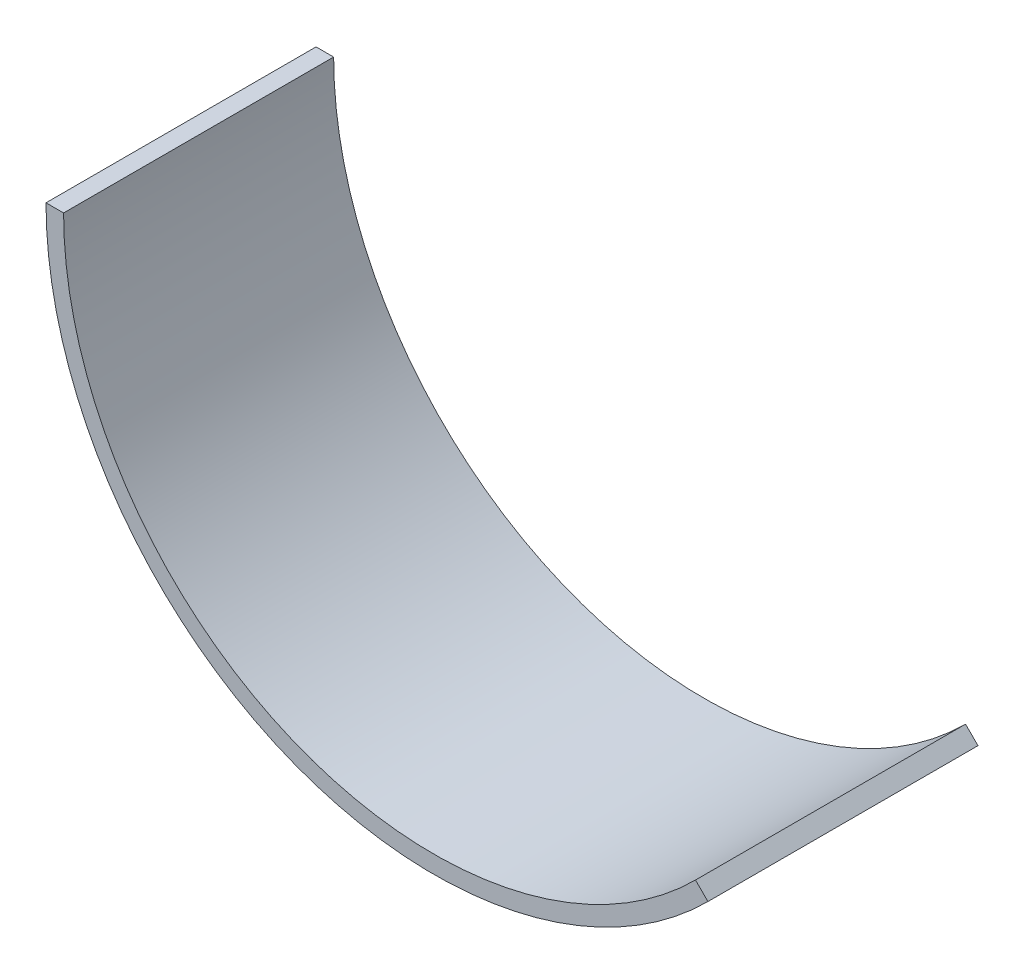
ISO-10303-21;
HEADER;
FILE_DESCRIPTION(('STEP AP214'),'2;1');
FILE_NAME('part.step','',(''),(''),'','','');
FILE_SCHEMA(('AUTOMOTIVE_DESIGN { 1 0 10303 214 1 1 1 1 }'));
ENDSEC;
DATA;
#1=APPLICATION_CONTEXT('core data for automotive mechanical design processes');
#2=APPLICATION_PROTOCOL_DEFINITION('international standard','automotive_design',2000,#1);
#3=PRODUCT_CONTEXT('',#1,'mechanical');
#4=PRODUCT('Part','Part','',(#3));
#5=PRODUCT_RELATED_PRODUCT_CATEGORY('part','',(#4));
#6=PRODUCT_DEFINITION_FORMATION('','',#4);
#7=PRODUCT_DEFINITION_CONTEXT('part definition',#1,'design');
#8=PRODUCT_DEFINITION('design','',#6,#7);
#9=PRODUCT_DEFINITION_SHAPE('','',#8);
#10=(LENGTH_UNIT() NAMED_UNIT(*) SI_UNIT(.MILLI.,.METRE.));
#11=(NAMED_UNIT(*) PLANE_ANGLE_UNIT() SI_UNIT($,.RADIAN.));
#12=(NAMED_UNIT(*) SI_UNIT($,.STERADIAN.) SOLID_ANGLE_UNIT());
#13=UNCERTAINTY_MEASURE_WITH_UNIT(LENGTH_MEASURE(1.E-05),#10,'distance_accuracy_value','');
#14=(GEOMETRIC_REPRESENTATION_CONTEXT(3) GLOBAL_UNCERTAINTY_ASSIGNED_CONTEXT((#13)) GLOBAL_UNIT_ASSIGNED_CONTEXT((#10,
#11,#12)) REPRESENTATION_CONTEXT('',''));
#15=CARTESIAN_POINT('',(0.,0.,0.));
#16=DIRECTION('',(0.,0.,1.));
#17=DIRECTION('',(1.,0.,0.));
#18=AXIS2_PLACEMENT_3D('',#15,#16,#17);
#19=CARTESIAN_POINT('',(0.,0.,50.699999946));
#20=DIRECTION('',(0.,0.,-1.));
#21=DIRECTION('',(-1.,0.,0.));
#22=AXIS2_PLACEMENT_3D('',#19,#20,#21);
#23=CYLINDRICAL_SURFACE('',#22,69.495999946);
#24=CARTESIAN_POINT('',(0.,0.,0.));
#25=DIRECTION('',(0.,0.,-1.));
#26=DIRECTION('',(1.,0.,0.));
#27=AXIS2_PLACEMENT_3D('',#24,#25,#26);
#28=CIRCLE('',#27,69.495999946);
#29=CARTESIAN_POINT('',(49.1410928271565,-49.1410928271565,0.));
#30=VERTEX_POINT('',#29);
#31=CARTESIAN_POINT('',(-69.495999946,0.,0.));
#32=VERTEX_POINT('',#31);
#33=EDGE_CURVE('E96',#30,#32,#28,.T.);
#34=ORIENTED_EDGE('',*,*,#33,.T.);
#35=DIRECTION('',(0.,0.,-1.));
#36=VECTOR('',#35,1.);
#37=CARTESIAN_POINT('',(-69.495999946,0.,50.699999946));
#38=LINE('',#37,#36);
#39=CARTESIAN_POINT('',(-69.495999946,0.,50.699999946));
#40=VERTEX_POINT('',#39);
#41=EDGE_CURVE('E11',#40,#32,#38,.T.);
#42=ORIENTED_EDGE('',*,*,#41,.F.);
#43=CARTESIAN_POINT('',(0.,0.,50.699999946));
#44=DIRECTION('',(0.,0.,-1.));
#45=DIRECTION('',(1.,0.,0.));
#46=AXIS2_PLACEMENT_3D('',#43,#44,#45);
#47=CIRCLE('',#46,69.495999946);
#48=CARTESIAN_POINT('',(49.1410928271565,-49.1410928271565,50.699999946));
#49=VERTEX_POINT('',#48);
#50=EDGE_CURVE('E84',#49,#40,#47,.T.);
#51=ORIENTED_EDGE('',*,*,#50,.F.);
#52=DIRECTION('',(0.,0.,-1.));
#53=VECTOR('',#52,1.);
#54=CARTESIAN_POINT('',(49.1410928271565,-49.1410928271565,50.699999946));
#55=LINE('',#54,#53);
#56=EDGE_CURVE('E92',#49,#30,#55,.T.);
#57=ORIENTED_EDGE('',*,*,#56,.T.);
#58=EDGE_LOOP('',(#34,#42,#51,#57));
#59=FACE_BOUND('',#58,.T.);
#60=ADVANCED_FACE('F33',(#59),#23,.F.);
#61=CARTESIAN_POINT('',(-72.797999946,0.,50.699999946));
#62=DIRECTION('',(0.,-1.,0.));
#63=DIRECTION('',(0.,0.,-1.));
#64=AXIS2_PLACEMENT_3D('',#61,#62,#63);
#65=PLANE('',#64);
#66=DIRECTION('',(-1.,0.,0.));
#67=VECTOR('',#66,1.);
#68=CARTESIAN_POINT('',(-72.797999946,0.,0.));
#69=LINE('',#68,#67);
#70=CARTESIAN_POINT('',(-72.797999946,0.,0.));
#71=VERTEX_POINT('',#70);
#72=EDGE_CURVE('E88',#32,#71,#69,.T.);
#73=ORIENTED_EDGE('',*,*,#72,.T.);
#74=DIRECTION('',(0.,0.,-1.));
#75=VECTOR('',#74,1.);
#76=CARTESIAN_POINT('',(-72.797999946,0.,50.699999946));
#77=LINE('',#76,#75);
#78=CARTESIAN_POINT('',(-72.797999946,0.,50.699999946));
#79=VERTEX_POINT('',#78);
#80=EDGE_CURVE('E41',#79,#71,#77,.T.);
#81=ORIENTED_EDGE('',*,*,#80,.F.);
#82=DIRECTION('',(-1.,0.,0.));
#83=VECTOR('',#82,1.);
#84=CARTESIAN_POINT('',(-72.797999946,0.,50.699999946));
#85=LINE('',#84,#83);
#86=EDGE_CURVE('E79',#40,#79,#85,.T.);
#87=ORIENTED_EDGE('',*,*,#86,.F.);
#88=ORIENTED_EDGE('',*,*,#41,.T.);
#89=EDGE_LOOP('',(#73,#81,#87,#88));
#90=FACE_BOUND('',#89,.T.);
#91=ADVANCED_FACE('F87',(#90),#65,.F.);
#92=CARTESIAN_POINT('',(0.,0.,50.699999946));
#93=DIRECTION('',(0.,0.,-1.));
#94=DIRECTION('',(-1.,0.,0.));
#95=AXIS2_PLACEMENT_3D('',#92,#93,#94);
#96=CYLINDRICAL_SURFACE('',#95,72.797999946);
#97=CARTESIAN_POINT('',(0.,0.,0.));
#98=DIRECTION('',(0.,0.,1.));
#99=DIRECTION('',(1.,0.,0.));
#100=AXIS2_PLACEMENT_3D('',#97,#98,#99);
#101=CIRCLE('',#100,72.797999946);
#102=CARTESIAN_POINT('',(51.4759594186345,-51.4759594186345,0.));
#103=VERTEX_POINT('',#102);
#104=EDGE_CURVE('E66',#71,#103,#101,.T.);
#105=ORIENTED_EDGE('',*,*,#104,.T.);
#106=DIRECTION('',(0.,0.,-1.));
#107=VECTOR('',#106,1.);
#108=CARTESIAN_POINT('',(51.4759594186345,-51.4759594186345,50.699999946));
#109=LINE('',#108,#107);
#110=CARTESIAN_POINT('',(51.4759594186345,-51.4759594186345,50.699999946));
#111=VERTEX_POINT('',#110);
#112=EDGE_CURVE('E89',#111,#103,#109,.T.);
#113=ORIENTED_EDGE('',*,*,#112,.F.);
#114=CARTESIAN_POINT('',(0.,0.,50.699999946));
#115=DIRECTION('',(0.,0.,1.));
#116=DIRECTION('',(1.,0.,0.));
#117=AXIS2_PLACEMENT_3D('',#114,#115,#116);
#118=CIRCLE('',#117,72.797999946);
#119=EDGE_CURVE('E82',#79,#111,#118,.T.);
#120=ORIENTED_EDGE('',*,*,#119,.F.);
#121=ORIENTED_EDGE('',*,*,#80,.T.);
#122=EDGE_LOOP('',(#105,#113,#120,#121));
#123=FACE_BOUND('',#122,.T.);
#124=ADVANCED_FACE('F90',(#123),#96,.T.);
#125=CARTESIAN_POINT('',(49.1410928271565,-49.1410928271565,50.699999946));
#126=DIRECTION('',(-0.707106781186548,-0.707106781186548,0.));
#127=DIRECTION('',(0.707106781186548,-0.707106781186548,0.));
#128=AXIS2_PLACEMENT_3D('',#125,#126,#127);
#129=PLANE('',#128);
#130=DIRECTION('',(-0.707106781186547,0.707106781186547,0.));
#131=VECTOR('',#130,1.);
#132=CARTESIAN_POINT('',(49.1410928271565,-49.1410928271565,0.));
#133=LINE('',#132,#131);
#134=EDGE_CURVE('E72',#103,#30,#133,.T.);
#135=ORIENTED_EDGE('',*,*,#134,.T.);
#136=ORIENTED_EDGE('',*,*,#56,.F.);
#137=DIRECTION('',(-0.707106781186547,0.707106781186547,0.));
#138=VECTOR('',#137,1.);
#139=CARTESIAN_POINT('',(49.1410928271565,-49.1410928271565,50.699999946));
#140=LINE('',#139,#138);
#141=EDGE_CURVE('E49',#111,#49,#140,.T.);
#142=ORIENTED_EDGE('',*,*,#141,.F.);
#143=ORIENTED_EDGE('',*,*,#112,.T.);
#144=EDGE_LOOP('',(#135,#136,#142,#143));
#145=FACE_BOUND('',#144,.T.);
#146=ADVANCED_FACE('F103',(#145),#129,.F.);
#147=CARTESIAN_POINT('',(0.,0.,50.699999946));
#148=DIRECTION('',(0.,0.,1.));
#149=DIRECTION('',(1.,0.,0.));
#150=AXIS2_PLACEMENT_3D('',#147,#148,#149);
#151=PLANE('',#150);
#152=ORIENTED_EDGE('',*,*,#50,.T.);
#153=ORIENTED_EDGE('',*,*,#86,.T.);
#154=ORIENTED_EDGE('',*,*,#119,.T.);
#155=ORIENTED_EDGE('',*,*,#141,.T.);
#156=EDGE_LOOP('',(#152,#153,#154,#155));
#157=FACE_BOUND('',#156,.T.);
#158=ADVANCED_FACE('F80',(#157),#151,.T.);
#159=CARTESIAN_POINT('',(0.,0.,0.));
#160=DIRECTION('',(0.,0.,1.));
#161=DIRECTION('',(1.,0.,0.));
#162=AXIS2_PLACEMENT_3D('',#159,#160,#161);
#163=PLANE('',#162);
#164=ORIENTED_EDGE('',*,*,#33,.F.);
#165=ORIENTED_EDGE('',*,*,#134,.F.);
#166=ORIENTED_EDGE('',*,*,#104,.F.);
#167=ORIENTED_EDGE('',*,*,#72,.F.);
#168=EDGE_LOOP('',(#164,#165,#166,#167));
#169=FACE_BOUND('',#168,.T.);
#170=ADVANCED_FACE('F106',(#169),#163,.F.);
#171=CLOSED_SHELL('',(#60,#91,#124,#146,#158,#170));
#172=MANIFOLD_SOLID_BREP('B2',#171);
#173=ADVANCED_BREP_SHAPE_REPRESENTATION('',(#18,#172),#14);
#174=SHAPE_DEFINITION_REPRESENTATION(#9,#173);
ENDSEC;
END-ISO-10303-21;
